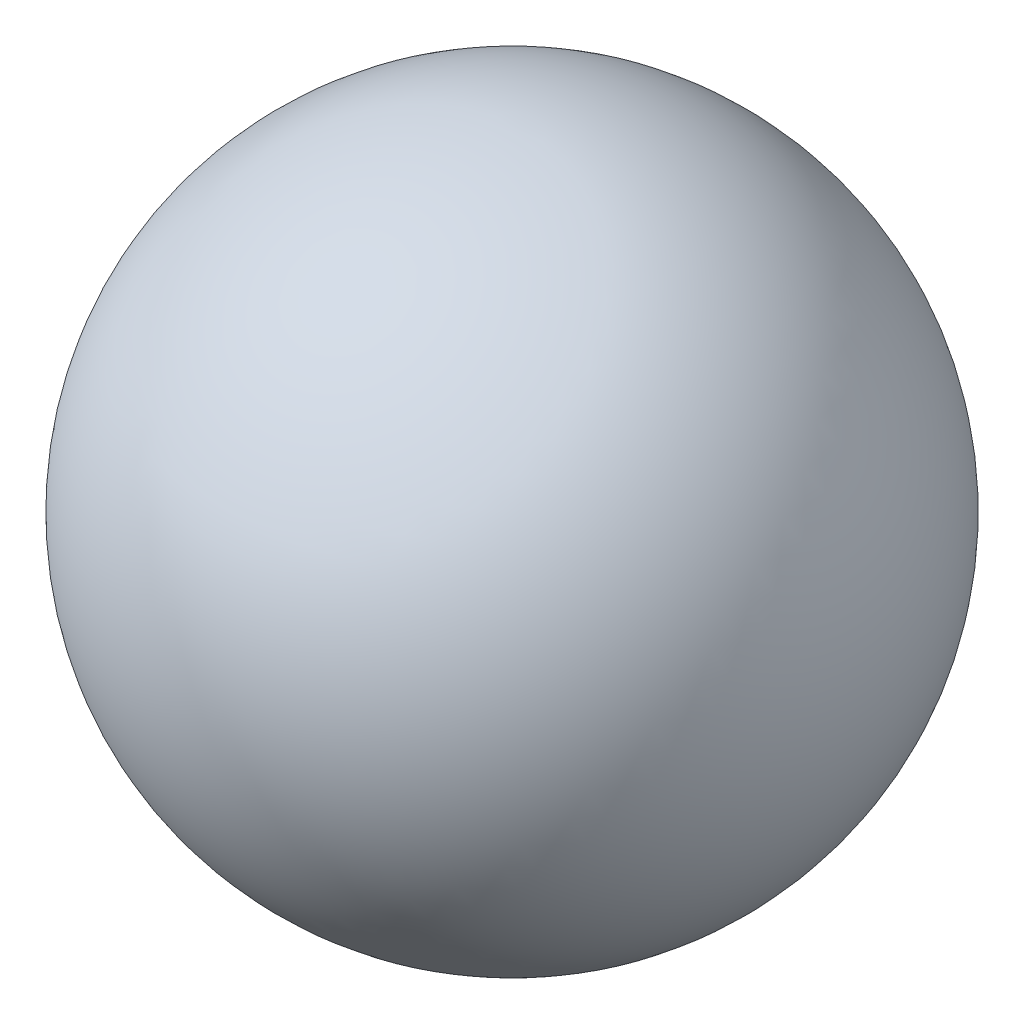
ISO-10303-21;
HEADER;
FILE_DESCRIPTION(('STEP AP214'),'2;1');
FILE_NAME('part.step','',(''),(''),'','','');
FILE_SCHEMA(('AUTOMOTIVE_DESIGN { 1 0 10303 214 1 1 1 1 }'));
ENDSEC;
DATA;
#1=APPLICATION_CONTEXT('core data for automotive mechanical design processes');
#2=APPLICATION_PROTOCOL_DEFINITION('international standard','automotive_design',2000,#1);
#3=PRODUCT_CONTEXT('',#1,'mechanical');
#4=PRODUCT('Part','Part','',(#3));
#5=PRODUCT_RELATED_PRODUCT_CATEGORY('part','',(#4));
#6=PRODUCT_DEFINITION_FORMATION('','',#4);
#7=PRODUCT_DEFINITION_CONTEXT('part definition',#1,'design');
#8=PRODUCT_DEFINITION('design','',#6,#7);
#9=PRODUCT_DEFINITION_SHAPE('','',#8);
#10=(LENGTH_UNIT() NAMED_UNIT(*) SI_UNIT(.MILLI.,.METRE.));
#11=(NAMED_UNIT(*) PLANE_ANGLE_UNIT() SI_UNIT($,.RADIAN.));
#12=(NAMED_UNIT(*) SI_UNIT($,.STERADIAN.) SOLID_ANGLE_UNIT());
#13=UNCERTAINTY_MEASURE_WITH_UNIT(LENGTH_MEASURE(1.E-05),#10,'distance_accuracy_value','');
#14=(GEOMETRIC_REPRESENTATION_CONTEXT(3) GLOBAL_UNCERTAINTY_ASSIGNED_CONTEXT((#13)) GLOBAL_UNIT_ASSIGNED_CONTEXT((#10,
#11,#12)) REPRESENTATION_CONTEXT('',''));
#15=CARTESIAN_POINT('',(0.,0.,0.));
#16=DIRECTION('',(0.,0.,1.));
#17=DIRECTION('',(1.,0.,0.));
#18=AXIS2_PLACEMENT_3D('',#15,#16,#17);
#19=CARTESIAN_POINT('',(0.,12.,0.));
#20=DIRECTION('',(0.,1.,0.));
#21=DIRECTION('',(1.,0.,0.));
#22=AXIS2_PLACEMENT_3D('',#19,#20,#21);
#23=SPHERICAL_SURFACE('',#22,3.5);
#24=CARTESIAN_POINT('',(0.,15.5,0.));
#25=VERTEX_POINT('',#24);
#26=VERTEX_LOOP('',#25);
#27=FACE_BOUND('',#26,.T.);
#28=ADVANCED_FACE('F29',(#27),#23,.T.);
#29=CLOSED_SHELL('',(#28));
#30=MANIFOLD_SOLID_BREP('B2',#29);
#31=ADVANCED_BREP_SHAPE_REPRESENTATION('',(#18,#30),#14);
#32=SHAPE_DEFINITION_REPRESENTATION(#9,#31);
ENDSEC;
END-ISO-10303-21;
